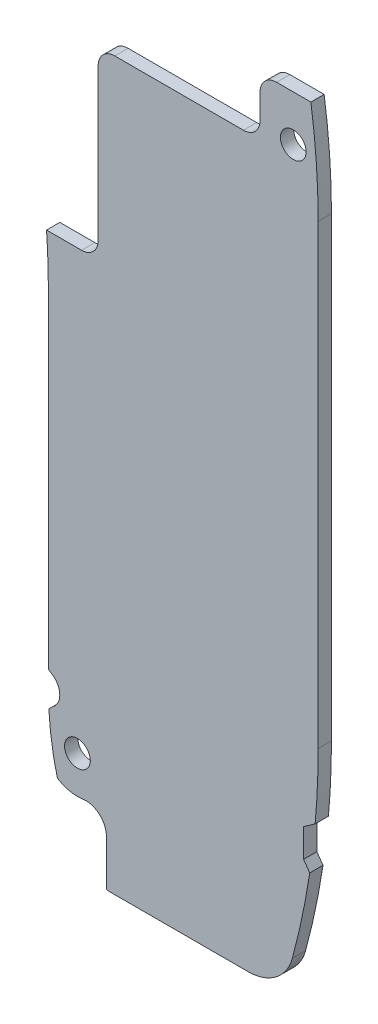
ISO-10303-21;
HEADER;
FILE_DESCRIPTION(('STEP AP214'),'2;1');
FILE_NAME('part.step','',(''),(''),'','','');
FILE_SCHEMA(('AUTOMOTIVE_DESIGN { 1 0 10303 214 1 1 1 1 }'));
ENDSEC;
DATA;
#1=APPLICATION_CONTEXT('core data for automotive mechanical design processes');
#2=APPLICATION_PROTOCOL_DEFINITION('international standard','automotive_design',2000,#1);
#3=PRODUCT_CONTEXT('',#1,'mechanical');
#4=PRODUCT('Part','Part','',(#3));
#5=PRODUCT_RELATED_PRODUCT_CATEGORY('part','',(#4));
#6=PRODUCT_DEFINITION_FORMATION('','',#4);
#7=PRODUCT_DEFINITION_CONTEXT('part definition',#1,'design');
#8=PRODUCT_DEFINITION('design','',#6,#7);
#9=PRODUCT_DEFINITION_SHAPE('','',#8);
#10=(LENGTH_UNIT() NAMED_UNIT(*) SI_UNIT(.MILLI.,.METRE.));
#11=(NAMED_UNIT(*) PLANE_ANGLE_UNIT() SI_UNIT($,.RADIAN.));
#12=(NAMED_UNIT(*) SI_UNIT($,.STERADIAN.) SOLID_ANGLE_UNIT());
#13=UNCERTAINTY_MEASURE_WITH_UNIT(LENGTH_MEASURE(1.E-05),#10,'distance_accuracy_value','');
#14=(GEOMETRIC_REPRESENTATION_CONTEXT(3) GLOBAL_UNCERTAINTY_ASSIGNED_CONTEXT((#13)) GLOBAL_UNIT_ASSIGNED_CONTEXT((#10,
#11,#12)) REPRESENTATION_CONTEXT('',''));
#15=CARTESIAN_POINT('',(0.,0.,0.));
#16=DIRECTION('',(0.,0.,1.));
#17=DIRECTION('',(1.,0.,0.));
#18=AXIS2_PLACEMENT_3D('',#15,#16,#17);
#19=CARTESIAN_POINT('',(-5.5,-58.9502537998691,0.9));
#20=CARTESIAN_POINT('',(-5.33570494437657,-58.9828095583744,0.9));
#21=CARTESIAN_POINT('',(-5.16748953016282,-59.,0.9));
#22=CARTESIAN_POINT('',(-4.99999999999999,-59.,0.9));
#23=B_SPLINE_CURVE_WITH_KNOTS('',3,(#19,#20,#21,#22),.UNSPECIFIED.,.F.,.F.,(4,4),
(0.409205779291312,1.),.UNSPECIFIED.);
#24=DIRECTION('',(0.,0.,1.));
#25=VECTOR('',#24,1.);
#26=SURFACE_OF_LINEAR_EXTRUSION('',#23,#25);
#27=CARTESIAN_POINT('',(-5.5,-58.9502537998691,2.5));
#28=CARTESIAN_POINT('',(-5.33570494437657,-58.9828095583744,2.5));
#29=CARTESIAN_POINT('',(-5.16748953016282,-59.,2.5));
#30=CARTESIAN_POINT('',(-4.99999999999999,-59.,2.5));
#31=B_SPLINE_CURVE_WITH_KNOTS('',3,(#27,#28,#29,#30),.UNSPECIFIED.,.F.,.F.,(4,4),
(0.409205779291312,1.),.UNSPECIFIED.);
#32=CARTESIAN_POINT('',(-5.5,-58.9502537998691,2.5));
#33=VERTEX_POINT('',#32);
#34=CARTESIAN_POINT('',(-4.99999999999999,-59.,2.5));
#35=VERTEX_POINT('',#34);
#36=EDGE_CURVE('E255',#33,#35,#31,.T.);
#37=ORIENTED_EDGE('',*,*,#36,.F.);
#38=DIRECTION('',(0.,0.,1.));
#39=VECTOR('',#38,1.);
#40=CARTESIAN_POINT('',(-5.5,-58.9502537998691,0.9));
#41=LINE('',#40,#39);
#42=CARTESIAN_POINT('',(-5.5,-58.9502537998691,0.9));
#43=VERTEX_POINT('',#42);
#44=EDGE_CURVE('E11',#43,#33,#41,.T.);
#45=ORIENTED_EDGE('',*,*,#44,.F.);
#46=CARTESIAN_POINT('',(-4.99999999999999,-59.,0.9));
#47=VERTEX_POINT('',#46);
#48=EDGE_CURVE('E348',#43,#47,#23,.T.);
#49=ORIENTED_EDGE('',*,*,#48,.T.);
#50=DIRECTION('',(0.,0.,1.));
#51=VECTOR('',#50,1.);
#52=CARTESIAN_POINT('',(-4.99999999999999,-59.,0.9));
#53=LINE('',#52,#51);
#54=EDGE_CURVE('E146',#47,#35,#53,.T.);
#55=ORIENTED_EDGE('',*,*,#54,.T.);
#56=EDGE_LOOP('',(#37,#45,#49,#55));
#57=FACE_BOUND('',#56,.T.);
#58=ADVANCED_FACE('F34',(#57),#26,.T.);
#59=CARTESIAN_POINT('',(-5.49999999999998,0.,0.9));
#60=DIRECTION('',(1.,0.,0.));
#61=DIRECTION('',(0.,1.,0.));
#62=AXIS2_PLACEMENT_3D('',#59,#60,#61);
#63=PLANE('',#62);
#64=DIRECTION('',(0.,1.,0.));
#65=VECTOR('',#64,1.);
#66=CARTESIAN_POINT('',(-5.49999999999998,0.,2.5));
#67=LINE('',#66,#65);
#68=CARTESIAN_POINT('',(-5.5,-53.4282032302755,2.5));
#69=VERTEX_POINT('',#68);
#70=EDGE_CURVE('E260',#33,#69,#67,.T.);
#71=ORIENTED_EDGE('',*,*,#70,.T.);
#72=DIRECTION('',(0.,0.,1.));
#73=VECTOR('',#72,1.);
#74=CARTESIAN_POINT('',(-5.5,-53.4282032302755,0.9));
#75=LINE('',#74,#73);
#76=CARTESIAN_POINT('',(-5.5,-53.4282032302755,0.9));
#77=VERTEX_POINT('',#76);
#78=EDGE_CURVE('E43',#77,#69,#75,.T.);
#79=ORIENTED_EDGE('',*,*,#78,.F.);
#80=DIRECTION('',(0.,1.,0.));
#81=VECTOR('',#80,1.);
#82=CARTESIAN_POINT('',(-5.49999999999998,0.,0.9));
#83=LINE('',#82,#81);
#84=EDGE_CURVE('E422',#43,#77,#83,.T.);
#85=ORIENTED_EDGE('',*,*,#84,.F.);
#86=ORIENTED_EDGE('',*,*,#44,.T.);
#87=EDGE_LOOP('',(#71,#79,#85,#86));
#88=FACE_BOUND('',#87,.T.);
#89=ADVANCED_FACE('F406',(#88),#63,.F.);
#90=CARTESIAN_POINT('',(-7.99999999999999,-53.4282032302755,0.9));
#91=DIRECTION('',(0.,0.,1.));
#92=DIRECTION('',(1.,0.,0.));
#93=AXIS2_PLACEMENT_3D('',#90,#91,#92);
#94=CYLINDRICAL_SURFACE('',#93,2.50000000000002);
#95=CARTESIAN_POINT('',(-7.99999999999999,-53.4282032302755,2.5));
#96=DIRECTION('',(0.,0.,-1.));
#97=DIRECTION('',(-1.,0.,0.));
#98=AXIS2_PLACEMENT_3D('',#95,#96,#97);
#99=CIRCLE('',#98,2.50000000000002);
#100=CARTESIAN_POINT('',(-8.35714285714285,-50.9538449337485,2.5));
#101=VERTEX_POINT('',#100);
#102=EDGE_CURVE('E266',#101,#69,#99,.T.);
#103=ORIENTED_EDGE('',*,*,#102,.F.);
#104=DIRECTION('',(0.,0.,1.));
#105=VECTOR('',#104,1.);
#106=CARTESIAN_POINT('',(-8.35714285714285,-50.9538449337485,0.9));
#107=LINE('',#106,#105);
#108=CARTESIAN_POINT('',(-8.35714285714285,-50.9538449337485,0.9));
#109=VERTEX_POINT('',#108);
#110=EDGE_CURVE('E396',#109,#101,#107,.T.);
#111=ORIENTED_EDGE('',*,*,#110,.F.);
#112=CARTESIAN_POINT('',(-7.99999999999999,-53.4282032302755,0.9));
#113=DIRECTION('',(0.,0.,-1.));
#114=DIRECTION('',(-1.,0.,0.));
#115=AXIS2_PLACEMENT_3D('',#112,#113,#114);
#116=CIRCLE('',#115,2.50000000000002);
#117=EDGE_CURVE('E403',#109,#77,#116,.T.);
#118=ORIENTED_EDGE('',*,*,#117,.T.);
#119=ORIENTED_EDGE('',*,*,#78,.T.);
#120=EDGE_LOOP('',(#103,#111,#118,#119));
#121=FACE_BOUND('',#120,.T.);
#122=ADVANCED_FACE('F401',(#121),#94,.F.);
#123=CARTESIAN_POINT('',(-8.99999999999999,-46.5,0.9));
#124=DIRECTION('',(0.,0.,1.));
#125=DIRECTION('',(1.,0.,0.));
#126=AXIS2_PLACEMENT_3D('',#123,#124,#125);
#127=CYLINDRICAL_SURFACE('',#126,4.49999999999995);
#128=CARTESIAN_POINT('',(-8.99999999999999,-46.5,2.5));
#129=DIRECTION('',(0.,0.,-1.));
#130=DIRECTION('',(-1.,0.,0.));
#131=AXIS2_PLACEMENT_3D('',#128,#129,#130);
#132=CIRCLE('',#131,4.49999999999995);
#133=CARTESIAN_POINT('',(-11.3970298699785,-50.3084442758731,2.5));
#134=VERTEX_POINT('',#133);
#135=EDGE_CURVE('E269',#101,#134,#132,.T.);
#136=ORIENTED_EDGE('',*,*,#135,.T.);
#137=DIRECTION('',(0.,0.,1.));
#138=VECTOR('',#137,1.);
#139=CARTESIAN_POINT('',(-11.3970298699785,-50.3084442758731,0.9));
#140=LINE('',#139,#138);
#141=CARTESIAN_POINT('',(-11.3970298699785,-50.3084442758731,0.9));
#142=VERTEX_POINT('',#141);
#143=EDGE_CURVE('E394',#142,#134,#140,.T.);
#144=ORIENTED_EDGE('',*,*,#143,.F.);
#145=CARTESIAN_POINT('',(-8.99999999999999,-46.5,0.9));
#146=DIRECTION('',(0.,0.,-1.));
#147=DIRECTION('',(-1.,0.,0.));
#148=AXIS2_PLACEMENT_3D('',#145,#146,#147);
#149=CIRCLE('',#148,4.49999999999995);
#150=EDGE_CURVE('E418',#109,#142,#149,.T.);
#151=ORIENTED_EDGE('',*,*,#150,.F.);
#152=ORIENTED_EDGE('',*,*,#110,.T.);
#153=EDGE_LOOP('',(#136,#144,#151,#152));
#154=FACE_BOUND('',#153,.T.);
#155=ADVANCED_FACE('F415',(#154),#127,.T.);
#156=CARTESIAN_POINT('',(-12.4410048815676,-43.6000887246283,0.9));
#157=CARTESIAN_POINT('',(-12.3137367209757,-45.8595415434526,0.9));
#158=CARTESIAN_POINT('',(-11.983663071939,-48.1227668725149,0.9));
#159=CARTESIAN_POINT('',(-11.3970298699785,-50.3084442758731,0.9));
#160=B_SPLINE_CURVE_WITH_KNOTS('',3,(#156,#157,#158,#159),.UNSPECIFIED.,.F.,.F.,(4,4),
(0.0264344323969909,0.973938345812274),.UNSPECIFIED.);
#161=DIRECTION('',(0.,0.,1.));
#162=VECTOR('',#161,1.);
#163=SURFACE_OF_LINEAR_EXTRUSION('',#160,#162);
#164=CARTESIAN_POINT('',(-12.4410048815676,-43.6000887246283,2.5));
#165=CARTESIAN_POINT('',(-12.3137367209757,-45.8595415434526,2.5));
#166=CARTESIAN_POINT('',(-11.983663071939,-48.1227668725149,2.5));
#167=CARTESIAN_POINT('',(-11.3970298699785,-50.3084442758731,2.5));
#168=B_SPLINE_CURVE_WITH_KNOTS('',3,(#164,#165,#166,#167),.UNSPECIFIED.,.F.,.F.,(4,4),
(0.0264344323969909,0.973938345812274),.UNSPECIFIED.);
#169=CARTESIAN_POINT('',(-12.4410048815676,-43.6000887246283,2.5));
#170=VERTEX_POINT('',#169);
#171=EDGE_CURVE('E272',#170,#134,#168,.T.);
#172=ORIENTED_EDGE('',*,*,#171,.F.);
#173=DIRECTION('',(0.,0.,1.));
#174=VECTOR('',#173,1.);
#175=CARTESIAN_POINT('',(-12.4410048815676,-43.6000887246283,0.9));
#176=LINE('',#175,#174);
#177=CARTESIAN_POINT('',(-12.4410048815676,-43.6000887246283,0.9));
#178=VERTEX_POINT('',#177);
#179=EDGE_CURVE('E392',#178,#170,#176,.T.);
#180=ORIENTED_EDGE('',*,*,#179,.F.);
#181=EDGE_CURVE('E420',#178,#142,#160,.T.);
#182=ORIENTED_EDGE('',*,*,#181,.T.);
#183=ORIENTED_EDGE('',*,*,#143,.T.);
#184=EDGE_LOOP('',(#172,#180,#182,#183));
#185=FACE_BOUND('',#184,.T.);
#186=ADVANCED_FACE('F436',(#185),#163,.T.);
#187=CARTESIAN_POINT('',(-8.99999999999999,-46.5,0.9));
#188=DIRECTION('',(0.,0.,1.));
#189=DIRECTION('',(1.,0.,0.));
#190=AXIS2_PLACEMENT_3D('',#187,#188,#189);
#191=CYLINDRICAL_SURFACE('',#190,4.5);
#192=CARTESIAN_POINT('',(-8.99999999999999,-46.5,2.5));
#193=DIRECTION('',(0.,0.,-1.));
#194=DIRECTION('',(-1.,0.,0.));
#195=AXIS2_PLACEMENT_3D('',#192,#193,#194);
#196=CIRCLE('',#195,4.5);
#197=CARTESIAN_POINT('',(-11.8551644936879,-43.0217769315377,2.5));
#198=VERTEX_POINT('',#197);
#199=EDGE_CURVE('E277',#170,#198,#196,.T.);
#200=ORIENTED_EDGE('',*,*,#199,.T.);
#201=DIRECTION('',(0.,0.,1.));
#202=VECTOR('',#201,1.);
#203=CARTESIAN_POINT('',(-11.8551644936879,-43.0217769315377,0.9));
#204=LINE('',#203,#202);
#205=CARTESIAN_POINT('',(-11.8551644936879,-43.0217769315377,0.9));
#206=VERTEX_POINT('',#205);
#207=EDGE_CURVE('E390',#206,#198,#204,.T.);
#208=ORIENTED_EDGE('',*,*,#207,.F.);
#209=CARTESIAN_POINT('',(-8.99999999999999,-46.5,0.9));
#210=DIRECTION('',(0.,0.,-1.));
#211=DIRECTION('',(-1.,0.,0.));
#212=AXIS2_PLACEMENT_3D('',#209,#210,#211);
#213=CIRCLE('',#212,4.5);
#214=EDGE_CURVE('E430',#178,#206,#213,.T.);
#215=ORIENTED_EDGE('',*,*,#214,.F.);
#216=ORIENTED_EDGE('',*,*,#179,.T.);
#217=EDGE_LOOP('',(#200,#208,#215,#216));
#218=FACE_BOUND('',#217,.T.);
#219=ADVANCED_FACE('F440',(#218),#191,.T.);
#220=CARTESIAN_POINT('',(-13.1241264908826,-41.4759000122211,0.9));
#221=DIRECTION('',(0.,0.,1.));
#222=DIRECTION('',(1.,0.,0.));
#223=AXIS2_PLACEMENT_3D('',#220,#221,#222);
#224=CYLINDRICAL_SURFACE('',#223,2.);
#225=CARTESIAN_POINT('',(-13.1241264908826,-41.4759000122211,2.5));
#226=DIRECTION('',(0.,0.,-1.));
#227=DIRECTION('',(-1.,0.,0.));
#228=AXIS2_PLACEMENT_3D('',#225,#226,#227);
#229=CIRCLE('',#228,2.);
#230=CARTESIAN_POINT('',(-11.9769736181805,-39.8375959236431,2.5));
#231=VERTEX_POINT('',#230);
#232=EDGE_CURVE('E283',#231,#198,#229,.T.);
#233=ORIENTED_EDGE('',*,*,#232,.F.);
#234=DIRECTION('',(0.,0.,1.));
#235=VECTOR('',#234,1.);
#236=CARTESIAN_POINT('',(-11.9769736181805,-39.8375959236431,0.9));
#237=LINE('',#236,#235);
#238=CARTESIAN_POINT('',(-11.9769736181805,-39.8375959236431,0.9));
#239=VERTEX_POINT('',#238);
#240=EDGE_CURVE('E388',#239,#231,#237,.T.);
#241=ORIENTED_EDGE('',*,*,#240,.F.);
#242=CARTESIAN_POINT('',(-13.1241264908826,-41.4759000122211,0.9));
#243=DIRECTION('',(0.,0.,-1.));
#244=DIRECTION('',(-1.,0.,0.));
#245=AXIS2_PLACEMENT_3D('',#242,#243,#244);
#246=CIRCLE('',#245,2.);
#247=EDGE_CURVE('E571',#239,#206,#246,.T.);
#248=ORIENTED_EDGE('',*,*,#247,.T.);
#249=ORIENTED_EDGE('',*,*,#207,.T.);
#250=EDGE_LOOP('',(#233,#241,#248,#249));
#251=FACE_BOUND('',#250,.T.);
#252=ADVANCED_FACE('F551',(#251),#224,.F.);
#253=CARTESIAN_POINT('',(-22.6578511519905,-32.3587649597745,0.9));
#254=DIRECTION('',(-0.57357643635105,-0.819152044288989,0.));
#255=DIRECTION('',(0.819152044288989,-0.57357643635105,0.));
#256=AXIS2_PLACEMENT_3D('',#253,#254,#255);
#257=PLANE('',#256);
#258=DIRECTION('',(0.819152044288989,-0.57357643635105,0.));
#259=VECTOR('',#258,1.);
#260=CARTESIAN_POINT('',(-22.6578511519905,-32.3587649597745,2.5));
#261=LINE('',#260,#259);
#262=CARTESIAN_POINT('',(-12.5,-39.4713689084105,2.5));
#263=VERTEX_POINT('',#262);
#264=EDGE_CURVE('E286',#263,#231,#261,.T.);
#265=ORIENTED_EDGE('',*,*,#264,.F.);
#266=DIRECTION('',(0.,0.,1.));
#267=VECTOR('',#266,1.);
#268=CARTESIAN_POINT('',(-12.5,-39.4713689084105,0.9));
#269=LINE('',#268,#267);
#270=CARTESIAN_POINT('',(-12.5,-39.4713689084105,0.9));
#271=VERTEX_POINT('',#270);
#272=EDGE_CURVE('E386',#271,#263,#269,.T.);
#273=ORIENTED_EDGE('',*,*,#272,.F.);
#274=DIRECTION('',(0.819152044288989,-0.57357643635105,0.));
#275=VECTOR('',#274,1.);
#276=CARTESIAN_POINT('',(-22.6578511519905,-32.3587649597745,0.9));
#277=LINE('',#276,#275);
#278=EDGE_CURVE('E569',#271,#239,#277,.T.);
#279=ORIENTED_EDGE('',*,*,#278,.T.);
#280=ORIENTED_EDGE('',*,*,#240,.T.);
#281=EDGE_LOOP('',(#265,#273,#279,#280));
#282=FACE_BOUND('',#281,.T.);
#283=ADVANCED_FACE('F548',(#282),#257,.T.);
#284=CARTESIAN_POINT('',(-12.5,0.,0.9));
#285=DIRECTION('',(1.,0.,0.));
#286=DIRECTION('',(0.,1.,0.));
#287=AXIS2_PLACEMENT_3D('',#284,#285,#286);
#288=PLANE('',#287);
#289=DIRECTION('',(0.,1.,0.));
#290=VECTOR('',#289,1.);
#291=CARTESIAN_POINT('',(-12.5,0.,2.5));
#292=LINE('',#291,#290);
#293=CARTESIAN_POINT('',(-12.5,0.,2.5));
#294=VERTEX_POINT('',#293);
#295=EDGE_CURVE('E289',#263,#294,#292,.T.);
#296=ORIENTED_EDGE('',*,*,#295,.T.);
#297=DIRECTION('',(0.,0.,1.));
#298=VECTOR('',#297,1.);
#299=CARTESIAN_POINT('',(-12.5,0.,0.9));
#300=LINE('',#299,#298);
#301=CARTESIAN_POINT('',(-12.5,0.,0.9));
#302=VERTEX_POINT('',#301);
#303=EDGE_CURVE('E384',#302,#294,#300,.T.);
#304=ORIENTED_EDGE('',*,*,#303,.F.);
#305=DIRECTION('',(0.,1.,0.));
#306=VECTOR('',#305,1.);
#307=CARTESIAN_POINT('',(-12.5,0.,0.9));
#308=LINE('',#307,#306);
#309=EDGE_CURVE('E570',#271,#302,#308,.T.);
#310=ORIENTED_EDGE('',*,*,#309,.F.);
#311=ORIENTED_EDGE('',*,*,#272,.T.);
#312=EDGE_LOOP('',(#296,#304,#310,#311));
#313=FACE_BOUND('',#312,.T.);
#314=ADVANCED_FACE('F544',(#313),#288,.F.);
#315=CARTESIAN_POINT('',(-102.5,0.,0.9));
#316=DIRECTION('',(0.,0.,1.));
#317=DIRECTION('',(1.,0.,0.));
#318=AXIS2_PLACEMENT_3D('',#315,#316,#317);
#319=CYLINDRICAL_SURFACE('',#318,90.);
#320=CARTESIAN_POINT('',(-102.5,0.,2.5));
#321=DIRECTION('',(0.,0.,-1.));
#322=DIRECTION('',(-1.,0.,0.));
#323=AXIS2_PLACEMENT_3D('',#320,#321,#322);
#324=CIRCLE('',#323,90.);
#325=CARTESIAN_POINT('',(-12.7156957945738,6.22725608494492,2.5));
#326=VERTEX_POINT('',#325);
#327=EDGE_CURVE('E292',#326,#294,#324,.T.);
#328=ORIENTED_EDGE('',*,*,#327,.F.);
#329=DIRECTION('',(0.,0.,1.));
#330=VECTOR('',#329,1.);
#331=CARTESIAN_POINT('',(-12.7156957945738,6.22725608494492,0.9));
#332=LINE('',#331,#330);
#333=CARTESIAN_POINT('',(-12.7156957945738,6.22725608494492,0.9));
#334=VERTEX_POINT('',#333);
#335=EDGE_CURVE('E382',#334,#326,#332,.T.);
#336=ORIENTED_EDGE('',*,*,#335,.F.);
#337=CARTESIAN_POINT('',(-102.5,0.,0.9));
#338=DIRECTION('',(0.,0.,-1.));
#339=DIRECTION('',(-1.,0.,0.));
#340=AXIS2_PLACEMENT_3D('',#337,#338,#339);
#341=CIRCLE('',#340,90.);
#342=EDGE_CURVE('E573',#334,#302,#341,.T.);
#343=ORIENTED_EDGE('',*,*,#342,.T.);
#344=ORIENTED_EDGE('',*,*,#303,.T.);
#345=EDGE_LOOP('',(#328,#336,#343,#344));
#346=FACE_BOUND('',#345,.T.);
#347=ADVANCED_FACE('F540',(#346),#319,.F.);
#348=CARTESIAN_POINT('',(0.,6.22725608494496,0.9));
#349=DIRECTION('',(0.,1.,0.));
#350=DIRECTION('',(-1.,0.,0.));
#351=AXIS2_PLACEMENT_3D('',#348,#349,#350);
#352=PLANE('',#351);
#353=DIRECTION('',(-1.,0.,0.));
#354=VECTOR('',#353,1.);
#355=CARTESIAN_POINT('',(0.,6.22725608494496,2.5));
#356=LINE('',#355,#354);
#357=CARTESIAN_POINT('',(-8.49999999999999,6.22725608494493,2.5));
#358=VERTEX_POINT('',#357);
#359=EDGE_CURVE('E295',#358,#326,#356,.T.);
#360=ORIENTED_EDGE('',*,*,#359,.F.);
#361=DIRECTION('',(0.,0.,1.));
#362=VECTOR('',#361,1.);
#363=CARTESIAN_POINT('',(-8.49999999999999,6.22725608494493,0.9));
#364=LINE('',#363,#362);
#365=CARTESIAN_POINT('',(-8.49999999999999,6.22725608494493,0.9));
#366=VERTEX_POINT('',#365);
#367=EDGE_CURVE('E380',#366,#358,#364,.T.);
#368=ORIENTED_EDGE('',*,*,#367,.F.);
#369=DIRECTION('',(-1.,0.,0.));
#370=VECTOR('',#369,1.);
#371=CARTESIAN_POINT('',(0.,6.22725608494496,0.9));
#372=LINE('',#371,#370);
#373=EDGE_CURVE('E578',#366,#334,#372,.T.);
#374=ORIENTED_EDGE('',*,*,#373,.T.);
#375=ORIENTED_EDGE('',*,*,#335,.T.);
#376=EDGE_LOOP('',(#360,#368,#374,#375));
#377=FACE_BOUND('',#376,.T.);
#378=ADVANCED_FACE('F536',(#377),#352,.T.);
#379=CARTESIAN_POINT('',(-8.49999999999999,8.22725608494493,0.9));
#380=DIRECTION('',(0.,0.,1.));
#381=DIRECTION('',(1.,0.,0.));
#382=AXIS2_PLACEMENT_3D('',#379,#380,#381);
#383=CYLINDRICAL_SURFACE('',#382,2.);
#384=CARTESIAN_POINT('',(-8.49999999999999,8.22725608494493,2.5));
#385=DIRECTION('',(0.,0.,-1.));
#386=DIRECTION('',(-1.,0.,0.));
#387=AXIS2_PLACEMENT_3D('',#384,#385,#386);
#388=CIRCLE('',#387,2.);
#389=CARTESIAN_POINT('',(-6.5,8.22725608494493,2.5));
#390=VERTEX_POINT('',#389);
#391=EDGE_CURVE('E298',#390,#358,#388,.T.);
#392=ORIENTED_EDGE('',*,*,#391,.F.);
#393=DIRECTION('',(0.,0.,1.));
#394=VECTOR('',#393,1.);
#395=CARTESIAN_POINT('',(-6.5,8.22725608494493,0.9));
#396=LINE('',#395,#394);
#397=CARTESIAN_POINT('',(-6.5,8.22725608494493,0.9));
#398=VERTEX_POINT('',#397);
#399=EDGE_CURVE('E378',#398,#390,#396,.T.);
#400=ORIENTED_EDGE('',*,*,#399,.F.);
#401=CARTESIAN_POINT('',(-8.49999999999999,8.22725608494493,0.9));
#402=DIRECTION('',(0.,0.,-1.));
#403=DIRECTION('',(-1.,0.,0.));
#404=AXIS2_PLACEMENT_3D('',#401,#402,#403);
#405=CIRCLE('',#404,2.);
#406=EDGE_CURVE('E581',#398,#366,#405,.T.);
#407=ORIENTED_EDGE('',*,*,#406,.T.);
#408=ORIENTED_EDGE('',*,*,#367,.T.);
#409=EDGE_LOOP('',(#392,#400,#407,#408));
#410=FACE_BOUND('',#409,.T.);
#411=ADVANCED_FACE('F532',(#410),#383,.F.);
#412=CARTESIAN_POINT('',(-6.5,0.,0.9));
#413=DIRECTION('',(-1.,0.,0.));
#414=DIRECTION('',(0.,-1.,0.));
#415=AXIS2_PLACEMENT_3D('',#412,#413,#414);
#416=PLANE('',#415);
#417=DIRECTION('',(0.,-1.,0.));
#418=VECTOR('',#417,1.);
#419=CARTESIAN_POINT('',(-6.5,0.,2.5));
#420=LINE('',#419,#418);
#421=CARTESIAN_POINT('',(-6.49999999999999,26.5,2.5));
#422=VERTEX_POINT('',#421);
#423=EDGE_CURVE('E301',#422,#390,#420,.T.);
#424=ORIENTED_EDGE('',*,*,#423,.F.);
#425=DIRECTION('',(0.,0.,1.));
#426=VECTOR('',#425,1.);
#427=CARTESIAN_POINT('',(-6.49999999999999,26.5,0.9));
#428=LINE('',#427,#426);
#429=CARTESIAN_POINT('',(-6.49999999999999,26.5,0.9));
#430=VERTEX_POINT('',#429);
#431=EDGE_CURVE('E376',#430,#422,#428,.T.);
#432=ORIENTED_EDGE('',*,*,#431,.F.);
#433=DIRECTION('',(0.,-1.,0.));
#434=VECTOR('',#433,1.);
#435=CARTESIAN_POINT('',(-6.5,0.,0.9));
#436=LINE('',#435,#434);
#437=EDGE_CURVE('E584',#430,#398,#436,.T.);
#438=ORIENTED_EDGE('',*,*,#437,.T.);
#439=ORIENTED_EDGE('',*,*,#399,.T.);
#440=EDGE_LOOP('',(#424,#432,#438,#439));
#441=FACE_BOUND('',#440,.T.);
#442=ADVANCED_FACE('F528',(#441),#416,.T.);
#443=CARTESIAN_POINT('',(-4.49999999999999,26.5,0.9));
#444=DIRECTION('',(0.,0.,1.));
#445=DIRECTION('',(1.,0.,0.));
#446=AXIS2_PLACEMENT_3D('',#443,#444,#445);
#447=CYLINDRICAL_SURFACE('',#446,2.);
#448=CARTESIAN_POINT('',(-4.49999999999999,26.5,2.5));
#449=DIRECTION('',(0.,0.,-1.));
#450=DIRECTION('',(-1.,0.,0.));
#451=AXIS2_PLACEMENT_3D('',#448,#449,#450);
#452=CIRCLE('',#451,2.);
#453=CARTESIAN_POINT('',(-4.49999999999999,28.5,2.5));
#454=VERTEX_POINT('',#453);
#455=EDGE_CURVE('E304',#454,#422,#452,.F.);
#456=ORIENTED_EDGE('',*,*,#455,.F.);
#457=DIRECTION('',(0.,0.,1.));
#458=VECTOR('',#457,1.);
#459=CARTESIAN_POINT('',(-4.49999999999999,28.5,0.9));
#460=LINE('',#459,#458);
#461=CARTESIAN_POINT('',(-4.49999999999999,28.5,0.9));
#462=VERTEX_POINT('',#461);
#463=EDGE_CURVE('E374',#462,#454,#460,.T.);
#464=ORIENTED_EDGE('',*,*,#463,.F.);
#465=CARTESIAN_POINT('',(-4.49999999999999,26.5,0.9));
#466=DIRECTION('',(0.,0.,-1.));
#467=DIRECTION('',(-1.,0.,0.));
#468=AXIS2_PLACEMENT_3D('',#465,#466,#467);
#469=CIRCLE('',#468,2.);
#470=EDGE_CURVE('E587',#462,#430,#469,.F.);
#471=ORIENTED_EDGE('',*,*,#470,.T.);
#472=ORIENTED_EDGE('',*,*,#431,.T.);
#473=EDGE_LOOP('',(#456,#464,#471,#472));
#474=FACE_BOUND('',#473,.T.);
#475=ADVANCED_FACE('F524',(#474),#447,.T.);
#476=CARTESIAN_POINT('',(0.,28.5,0.9));
#477=DIRECTION('',(0.,1.,0.));
#478=DIRECTION('',(0.,0.,1.));
#479=AXIS2_PLACEMENT_3D('',#476,#477,#478);
#480=PLANE('',#479);
#481=DIRECTION('',(-1.,0.,0.));
#482=VECTOR('',#481,1.);
#483=CARTESIAN_POINT('',(0.,28.5,2.5));
#484=LINE('',#483,#482);
#485=CARTESIAN_POINT('',(11.,28.5,2.5));
#486=VERTEX_POINT('',#485);
#487=EDGE_CURVE('E307',#486,#454,#484,.T.);
#488=ORIENTED_EDGE('',*,*,#487,.F.);
#489=DIRECTION('',(0.,0.,1.));
#490=VECTOR('',#489,1.);
#491=CARTESIAN_POINT('',(11.,28.5,0.9));
#492=LINE('',#491,#490);
#493=CARTESIAN_POINT('',(11.,28.5,0.9));
#494=VERTEX_POINT('',#493);
#495=EDGE_CURVE('E372',#494,#486,#492,.T.);
#496=ORIENTED_EDGE('',*,*,#495,.F.);
#497=DIRECTION('',(-1.,0.,0.));
#498=VECTOR('',#497,1.);
#499=CARTESIAN_POINT('',(0.,28.5,0.9));
#500=LINE('',#499,#498);
#501=EDGE_CURVE('E590',#494,#462,#500,.T.);
#502=ORIENTED_EDGE('',*,*,#501,.T.);
#503=ORIENTED_EDGE('',*,*,#463,.T.);
#504=EDGE_LOOP('',(#488,#496,#502,#503));
#505=FACE_BOUND('',#504,.T.);
#506=ADVANCED_FACE('F520',(#505),#480,.T.);
#507=CARTESIAN_POINT('',(11.,30.5,0.9));
#508=DIRECTION('',(0.,0.,1.));
#509=DIRECTION('',(1.,0.,0.));
#510=AXIS2_PLACEMENT_3D('',#507,#508,#509);
#511=CYLINDRICAL_SURFACE('',#510,2.);
#512=CARTESIAN_POINT('',(11.,30.5,2.5));
#513=DIRECTION('',(0.,0.,-1.));
#514=DIRECTION('',(-1.,0.,0.));
#515=AXIS2_PLACEMENT_3D('',#512,#513,#514);
#516=CIRCLE('',#515,2.);
#517=CARTESIAN_POINT('',(13.,30.5,2.5));
#518=VERTEX_POINT('',#517);
#519=EDGE_CURVE('E310',#518,#486,#516,.T.);
#520=ORIENTED_EDGE('',*,*,#519,.F.);
#521=DIRECTION('',(0.,0.,1.));
#522=VECTOR('',#521,1.);
#523=CARTESIAN_POINT('',(13.,30.5,0.9));
#524=LINE('',#523,#522);
#525=CARTESIAN_POINT('',(13.,30.5,0.9));
#526=VERTEX_POINT('',#525);
#527=EDGE_CURVE('E370',#526,#518,#524,.T.);
#528=ORIENTED_EDGE('',*,*,#527,.F.);
#529=CARTESIAN_POINT('',(11.,30.5,0.9));
#530=DIRECTION('',(0.,0.,-1.));
#531=DIRECTION('',(-1.,0.,0.));
#532=AXIS2_PLACEMENT_3D('',#529,#530,#531);
#533=CIRCLE('',#532,2.);
#534=EDGE_CURVE('E593',#526,#494,#533,.T.);
#535=ORIENTED_EDGE('',*,*,#534,.T.);
#536=ORIENTED_EDGE('',*,*,#495,.T.);
#537=EDGE_LOOP('',(#520,#528,#535,#536));
#538=FACE_BOUND('',#537,.T.);
#539=ADVANCED_FACE('F516',(#538),#511,.F.);
#540=CARTESIAN_POINT('',(13.,0.,0.9));
#541=DIRECTION('',(-1.,0.,0.));
#542=DIRECTION('',(0.,-1.,0.));
#543=AXIS2_PLACEMENT_3D('',#540,#541,#542);
#544=PLANE('',#543);
#545=DIRECTION('',(0.,-1.,0.));
#546=VECTOR('',#545,1.);
#547=CARTESIAN_POINT('',(13.,0.,2.5));
#548=LINE('',#547,#546);
#549=CARTESIAN_POINT('',(13.,33.5,2.5));
#550=VERTEX_POINT('',#549);
#551=EDGE_CURVE('E313',#550,#518,#548,.T.);
#552=ORIENTED_EDGE('',*,*,#551,.F.);
#553=DIRECTION('',(0.,0.,1.));
#554=VECTOR('',#553,1.);
#555=CARTESIAN_POINT('',(13.,33.5,0.9));
#556=LINE('',#555,#554);
#557=CARTESIAN_POINT('',(13.,33.5,0.9));
#558=VERTEX_POINT('',#557);
#559=EDGE_CURVE('E368',#558,#550,#556,.T.);
#560=ORIENTED_EDGE('',*,*,#559,.F.);
#561=DIRECTION('',(0.,-1.,0.));
#562=VECTOR('',#561,1.);
#563=CARTESIAN_POINT('',(13.,0.,0.9));
#564=LINE('',#563,#562);
#565=EDGE_CURVE('E596',#558,#526,#564,.T.);
#566=ORIENTED_EDGE('',*,*,#565,.T.);
#567=ORIENTED_EDGE('',*,*,#527,.T.);
#568=EDGE_LOOP('',(#552,#560,#566,#567));
#569=FACE_BOUND('',#568,.T.);
#570=ADVANCED_FACE('F512',(#569),#544,.T.);
#571=CARTESIAN_POINT('',(15.,33.5,0.9));
#572=DIRECTION('',(0.,0.,1.));
#573=DIRECTION('',(1.,0.,0.));
#574=AXIS2_PLACEMENT_3D('',#571,#572,#573);
#575=CYLINDRICAL_SURFACE('',#574,2.);
#576=CARTESIAN_POINT('',(15.,33.5,2.5));
#577=DIRECTION('',(0.,0.,-1.));
#578=DIRECTION('',(-1.,0.,0.));
#579=AXIS2_PLACEMENT_3D('',#576,#577,#578);
#580=CIRCLE('',#579,2.);
#581=CARTESIAN_POINT('',(15.,35.5,2.5));
#582=VERTEX_POINT('',#581);
#583=EDGE_CURVE('E316',#582,#550,#580,.F.);
#584=ORIENTED_EDGE('',*,*,#583,.F.);
#585=DIRECTION('',(0.,0.,1.));
#586=VECTOR('',#585,1.);
#587=CARTESIAN_POINT('',(15.,35.5,0.9));
#588=LINE('',#587,#586);
#589=CARTESIAN_POINT('',(15.,35.5,0.9));
#590=VERTEX_POINT('',#589);
#591=EDGE_CURVE('E366',#590,#582,#588,.T.);
#592=ORIENTED_EDGE('',*,*,#591,.F.);
#593=CARTESIAN_POINT('',(15.,33.5,0.9));
#594=DIRECTION('',(0.,0.,-1.));
#595=DIRECTION('',(-1.,0.,0.));
#596=AXIS2_PLACEMENT_3D('',#593,#594,#595);
#597=CIRCLE('',#596,2.);
#598=EDGE_CURVE('E599',#590,#558,#597,.F.);
#599=ORIENTED_EDGE('',*,*,#598,.T.);
#600=ORIENTED_EDGE('',*,*,#559,.T.);
#601=EDGE_LOOP('',(#584,#592,#599,#600));
#602=FACE_BOUND('',#601,.T.);
#603=ADVANCED_FACE('F508',(#602),#575,.T.);
#604=CARTESIAN_POINT('',(0.,35.5,0.9));
#605=DIRECTION('',(0.,1.,0.));
#606=DIRECTION('',(0.,0.,1.));
#607=AXIS2_PLACEMENT_3D('',#604,#605,#606);
#608=PLANE('',#607);
#609=DIRECTION('',(-1.,0.,0.));
#610=VECTOR('',#609,1.);
#611=CARTESIAN_POINT('',(0.,35.5,2.5));
#612=LINE('',#611,#610);
#613=CARTESIAN_POINT('',(19.1226071624767,35.5,2.5));
#614=VERTEX_POINT('',#613);
#615=EDGE_CURVE('E319',#614,#582,#612,.T.);
#616=ORIENTED_EDGE('',*,*,#615,.F.);
#617=DIRECTION('',(0.,0.,1.));
#618=VECTOR('',#617,1.);
#619=CARTESIAN_POINT('',(19.1226071624767,35.5,0.9));
#620=LINE('',#619,#618);
#621=CARTESIAN_POINT('',(19.1226071624767,35.5,0.9));
#622=VERTEX_POINT('',#621);
#623=EDGE_CURVE('E364',#622,#614,#620,.T.);
#624=ORIENTED_EDGE('',*,*,#623,.F.);
#625=DIRECTION('',(-1.,0.,0.));
#626=VECTOR('',#625,1.);
#627=CARTESIAN_POINT('',(0.,35.5,0.9));
#628=LINE('',#627,#626);
#629=EDGE_CURVE('E602',#622,#590,#628,.T.);
#630=ORIENTED_EDGE('',*,*,#629,.T.);
#631=ORIENTED_EDGE('',*,*,#591,.T.);
#632=EDGE_LOOP('',(#616,#624,#630,#631));
#633=FACE_BOUND('',#632,.T.);
#634=ADVANCED_FACE('F504',(#633),#608,.T.);
#635=CARTESIAN_POINT('',(-62.5,23.5,0.9));
#636=DIRECTION('',(0.,0.,1.));
#637=DIRECTION('',(1.,0.,0.));
#638=AXIS2_PLACEMENT_3D('',#635,#636,#637);
#639=CYLINDRICAL_SURFACE('',#638,82.5);
#640=CARTESIAN_POINT('',(-62.5,23.5,2.5));
#641=DIRECTION('',(0.,0.,-1.));
#642=DIRECTION('',(-1.,0.,0.));
#643=AXIS2_PLACEMENT_3D('',#640,#641,#642);
#644=CIRCLE('',#643,82.5);
#645=CARTESIAN_POINT('',(20.,23.5,2.5));
#646=VERTEX_POINT('',#645);
#647=EDGE_CURVE('E322',#614,#646,#644,.T.);
#648=ORIENTED_EDGE('',*,*,#647,.T.);
#649=DIRECTION('',(0.,0.,1.));
#650=VECTOR('',#649,1.);
#651=CARTESIAN_POINT('',(20.,23.5,0.9));
#652=LINE('',#651,#650);
#653=CARTESIAN_POINT('',(20.,23.5,0.9));
#654=VERTEX_POINT('',#653);
#655=EDGE_CURVE('E361',#654,#646,#652,.T.);
#656=ORIENTED_EDGE('',*,*,#655,.F.);
#657=CARTESIAN_POINT('',(-62.5,23.5,0.9));
#658=DIRECTION('',(0.,0.,-1.));
#659=DIRECTION('',(-1.,0.,0.));
#660=AXIS2_PLACEMENT_3D('',#657,#658,#659);
#661=CIRCLE('',#660,82.5);
#662=EDGE_CURVE('E605',#622,#654,#661,.T.);
#663=ORIENTED_EDGE('',*,*,#662,.F.);
#664=ORIENTED_EDGE('',*,*,#623,.T.);
#665=EDGE_LOOP('',(#648,#656,#663,#664));
#666=FACE_BOUND('',#665,.T.);
#667=ADVANCED_FACE('F500',(#666),#639,.T.);
#668=CARTESIAN_POINT('',(20.,0.,0.9));
#669=DIRECTION('',(-1.,0.,0.));
#670=DIRECTION('',(0.,0.,1.));
#671=AXIS2_PLACEMENT_3D('',#668,#669,#670);
#672=PLANE('',#671);
#673=DIRECTION('',(0.,-1.,0.));
#674=VECTOR('',#673,1.);
#675=CARTESIAN_POINT('',(20.,0.,2.5));
#676=LINE('',#675,#674);
#677=CARTESIAN_POINT('',(20.,-31.5,2.5));
#678=VERTEX_POINT('',#677);
#679=EDGE_CURVE('E324',#646,#678,#676,.T.);
#680=ORIENTED_EDGE('',*,*,#679,.T.);
#681=DIRECTION('',(0.,0.,1.));
#682=VECTOR('',#681,1.);
#683=CARTESIAN_POINT('',(20.,-31.5,0.9));
#684=LINE('',#683,#682);
#685=CARTESIAN_POINT('',(20.,-31.5,0.9));
#686=VERTEX_POINT('',#685);
#687=EDGE_CURVE('E358',#686,#678,#684,.T.);
#688=ORIENTED_EDGE('',*,*,#687,.F.);
#689=DIRECTION('',(0.,-1.,0.));
#690=VECTOR('',#689,1.);
#691=CARTESIAN_POINT('',(20.,0.,0.9));
#692=LINE('',#691,#690);
#693=EDGE_CURVE('E607',#654,#686,#692,.T.);
#694=ORIENTED_EDGE('',*,*,#693,.F.);
#695=ORIENTED_EDGE('',*,*,#655,.T.);
#696=EDGE_LOOP('',(#680,#688,#694,#695));
#697=FACE_BOUND('',#696,.T.);
#698=ADVANCED_FACE('F496',(#697),#672,.F.);
#699=CARTESIAN_POINT('',(-70.0000000000003,-31.5,0.9));
#700=DIRECTION('',(0.,0.,1.));
#701=DIRECTION('',(1.,0.,0.));
#702=AXIS2_PLACEMENT_3D('',#699,#700,#701);
#703=CYLINDRICAL_SURFACE('',#702,90.0000000000003);
#704=CARTESIAN_POINT('',(-70.0000000000003,-31.5,2.5));
#705=DIRECTION('',(0.,0.,-1.));
#706=DIRECTION('',(-1.,0.,0.));
#707=AXIS2_PLACEMENT_3D('',#704,#705,#706);
#708=CIRCLE('',#707,90.0000000000003);
#709=CARTESIAN_POINT('',(19.6395417382662,-39.5468973495153,2.5));
#710=VERTEX_POINT('',#709);
#711=EDGE_CURVE('E326',#678,#710,#708,.T.);
#712=ORIENTED_EDGE('',*,*,#711,.T.);
#713=DIRECTION('',(0.,0.,1.));
#714=VECTOR('',#713,1.);
#715=CARTESIAN_POINT('',(19.6395417382662,-39.5468973495153,0.9));
#716=LINE('',#715,#714);
#717=CARTESIAN_POINT('',(19.6395417382662,-39.5468973495153,0.9));
#718=VERTEX_POINT('',#717);
#719=EDGE_CURVE('E356',#718,#710,#716,.T.);
#720=ORIENTED_EDGE('',*,*,#719,.F.);
#721=CARTESIAN_POINT('',(-70.0000000000003,-31.5,0.9));
#722=DIRECTION('',(0.,0.,-1.));
#723=DIRECTION('',(-1.,0.,0.));
#724=AXIS2_PLACEMENT_3D('',#721,#722,#723);
#725=CIRCLE('',#724,90.0000000000003);
#726=EDGE_CURVE('E609',#686,#718,#725,.T.);
#727=ORIENTED_EDGE('',*,*,#726,.F.);
#728=ORIENTED_EDGE('',*,*,#687,.T.);
#729=EDGE_LOOP('',(#712,#720,#727,#728));
#730=FACE_BOUND('',#729,.T.);
#731=ADVANCED_FACE('F492',(#730),#703,.T.);
#732=CARTESIAN_POINT('',(25.0421752362054,-35.763932648074,0.9));
#733=DIRECTION('',(0.57357643635104,-0.819152044288996,0.));
#734=DIRECTION('',(0.819152044288996,0.57357643635104,0.));
#735=AXIS2_PLACEMENT_3D('',#732,#733,#734);
#736=PLANE('',#735);
#737=DIRECTION('',(0.819152044288996,0.57357643635104,0.));
#738=VECTOR('',#737,1.);
#739=CARTESIAN_POINT('',(25.0421752362054,-35.763932648074,2.5));
#740=LINE('',#739,#738);
#741=CARTESIAN_POINT('',(18.2474075308823,-40.5216802157251,2.5));
#742=VERTEX_POINT('',#741);
#743=EDGE_CURVE('E329',#742,#710,#740,.T.);
#744=ORIENTED_EDGE('',*,*,#743,.F.);
#745=DIRECTION('',(0.,0.,1.));
#746=VECTOR('',#745,1.);
#747=CARTESIAN_POINT('',(18.2474075308823,-40.5216802157251,0.9));
#748=LINE('',#747,#746);
#749=CARTESIAN_POINT('',(18.2474075308823,-40.5216802157251,0.9));
#750=VERTEX_POINT('',#749);
#751=EDGE_CURVE('E354',#750,#742,#748,.T.);
#752=ORIENTED_EDGE('',*,*,#751,.F.);
#753=DIRECTION('',(0.819152044288996,0.57357643635104,0.));
#754=VECTOR('',#753,1.);
#755=CARTESIAN_POINT('',(25.0421752362054,-35.763932648074,0.9));
#756=LINE('',#755,#754);
#757=EDGE_CURVE('E611',#750,#718,#756,.T.);
#758=ORIENTED_EDGE('',*,*,#757,.T.);
#759=ORIENTED_EDGE('',*,*,#719,.T.);
#760=EDGE_LOOP('',(#744,#752,#758,#759));
#761=FACE_BOUND('',#760,.T.);
#762=ADVANCED_FACE('F488',(#761),#736,.T.);
#763=CARTESIAN_POINT('',(18.2474075308823,0.,0.9));
#764=DIRECTION('',(1.,0.,0.));
#765=DIRECTION('',(0.,0.,-1.));
#766=AXIS2_PLACEMENT_3D('',#763,#764,#765);
#767=PLANE('',#766);
#768=DIRECTION('',(0.,1.,0.));
#769=VECTOR('',#768,1.);
#770=CARTESIAN_POINT('',(18.2474075308823,0.,2.5));
#771=LINE('',#770,#769);
#772=CARTESIAN_POINT('',(18.2474075308823,-43.9396131354404,2.5));
#773=VERTEX_POINT('',#772);
#774=EDGE_CURVE('E332',#773,#742,#771,.T.);
#775=ORIENTED_EDGE('',*,*,#774,.F.);
#776=DIRECTION('',(0.,0.,1.));
#777=VECTOR('',#776,1.);
#778=CARTESIAN_POINT('',(18.2474075308823,-43.9396131354404,0.9));
#779=LINE('',#778,#777);
#780=CARTESIAN_POINT('',(18.2474075308823,-43.9396131354404,0.9));
#781=VERTEX_POINT('',#780);
#782=EDGE_CURVE('E352',#781,#773,#779,.T.);
#783=ORIENTED_EDGE('',*,*,#782,.F.);
#784=DIRECTION('',(0.,1.,0.));
#785=VECTOR('',#784,1.);
#786=CARTESIAN_POINT('',(18.2474075308823,0.,0.9));
#787=LINE('',#786,#785);
#788=EDGE_CURVE('E614',#781,#750,#787,.T.);
#789=ORIENTED_EDGE('',*,*,#788,.T.);
#790=ORIENTED_EDGE('',*,*,#751,.T.);
#791=EDGE_LOOP('',(#775,#783,#789,#790));
#792=FACE_BOUND('',#791,.T.);
#793=ADVANCED_FACE('F484',(#792),#767,.T.);
#794=CARTESIAN_POINT('',(-8.40067087682161,-5.88221307396904,0.9));
#795=DIRECTION('',(0.819152044289002,0.573576436351031,0.));
#796=DIRECTION('',(-0.573576436351031,0.819152044289002,0.));
#797=AXIS2_PLACEMENT_3D('',#794,#795,#796);
#798=PLANE('',#797);
#799=DIRECTION('',(-0.573576436351031,0.819152044289002,0.));
#800=VECTOR('',#799,1.);
#801=CARTESIAN_POINT('',(-8.40067087682161,-5.88221307396904,2.5));
#802=LINE('',#801,#800);
#803=CARTESIAN_POINT('',(18.983192225318,-44.9904225801902,2.5));
#804=VERTEX_POINT('',#803);
#805=EDGE_CURVE('E335',#804,#773,#802,.T.);
#806=ORIENTED_EDGE('',*,*,#805,.F.);
#807=DIRECTION('',(0.,0.,1.));
#808=VECTOR('',#807,1.);
#809=CARTESIAN_POINT('',(18.983192225318,-44.9904225801902,0.9));
#810=LINE('',#809,#808);
#811=CARTESIAN_POINT('',(18.983192225318,-44.9904225801902,0.9));
#812=VERTEX_POINT('',#811);
#813=EDGE_CURVE('E241',#812,#804,#810,.T.);
#814=ORIENTED_EDGE('',*,*,#813,.F.);
#815=DIRECTION('',(-0.573576436351031,0.819152044289002,0.));
#816=VECTOR('',#815,1.);
#817=CARTESIAN_POINT('',(-8.40067087682161,-5.88221307396904,0.9));
#818=LINE('',#817,#816);
#819=EDGE_CURVE('E234',#812,#781,#818,.T.);
#820=ORIENTED_EDGE('',*,*,#819,.T.);
#821=ORIENTED_EDGE('',*,*,#782,.T.);
#822=EDGE_LOOP('',(#806,#814,#820,#821));
#823=FACE_BOUND('',#822,.T.);
#824=ADVANCED_FACE('F481',(#823),#798,.T.);
#825=CARTESIAN_POINT('',(-70.0000000000003,-31.5,0.9));
#826=DIRECTION('',(0.,0.,1.));
#827=DIRECTION('',(1.,0.,0.));
#828=AXIS2_PLACEMENT_3D('',#825,#826,#827);
#829=CYLINDRICAL_SURFACE('',#828,90.0000000000003);
#830=CARTESIAN_POINT('',(-70.0000000000003,-31.5,2.5));
#831=DIRECTION('',(0.,0.,-1.));
#832=DIRECTION('',(-1.,0.,0.));
#833=AXIS2_PLACEMENT_3D('',#830,#831,#832);
#834=CIRCLE('',#833,90.0000000000003);
#835=CARTESIAN_POINT('',(16.8961655909624,-54.9319526627219,2.5));
#836=VERTEX_POINT('',#835);
#837=EDGE_CURVE('E240',#804,#836,#834,.T.);
#838=ORIENTED_EDGE('',*,*,#837,.T.);
#839=DIRECTION('',(0.,0.,1.));
#840=VECTOR('',#839,1.);
#841=CARTESIAN_POINT('',(16.8961655909624,-54.9319526627219,0.9));
#842=LINE('',#841,#840);
#843=CARTESIAN_POINT('',(16.8961655909624,-54.9319526627219,0.9));
#844=VERTEX_POINT('',#843);
#845=EDGE_CURVE('E237',#844,#836,#842,.T.);
#846=ORIENTED_EDGE('',*,*,#845,.F.);
#847=CARTESIAN_POINT('',(-70.0000000000003,-31.5,0.9));
#848=DIRECTION('',(0.,0.,-1.));
#849=DIRECTION('',(-1.,0.,0.));
#850=AXIS2_PLACEMENT_3D('',#847,#848,#849);
#851=CIRCLE('',#850,90.0000000000003);
#852=EDGE_CURVE('E226',#812,#844,#851,.T.);
#853=ORIENTED_EDGE('',*,*,#852,.F.);
#854=ORIENTED_EDGE('',*,*,#813,.T.);
#855=EDGE_LOOP('',(#838,#846,#853,#854));
#856=FACE_BOUND('',#855,.T.);
#857=ADVANCED_FACE('F238',(#856),#829,.T.);
#858=CARTESIAN_POINT('',(11.5858443604036,-53.5,0.9));
#859=DIRECTION('',(0.,0.,1.));
#860=DIRECTION('',(1.,0.,0.));
#861=AXIS2_PLACEMENT_3D('',#858,#859,#860);
#862=CYLINDRICAL_SURFACE('',#861,5.5);
#863=CARTESIAN_POINT('',(11.5858443604036,-53.5,2.5));
#864=DIRECTION('',(0.,0.,-1.));
#865=DIRECTION('',(-1.,0.,0.));
#866=AXIS2_PLACEMENT_3D('',#863,#864,#865);
#867=CIRCLE('',#866,5.5);
#868=CARTESIAN_POINT('',(11.5858443604036,-59.,2.5));
#869=VERTEX_POINT('',#868);
#870=EDGE_CURVE('E139',#836,#869,#867,.T.);
#871=ORIENTED_EDGE('',*,*,#870,.T.);
#872=DIRECTION('',(0.,0.,1.));
#873=VECTOR('',#872,1.);
#874=CARTESIAN_POINT('',(11.5858443604036,-59.,0.9));
#875=LINE('',#874,#873);
#876=CARTESIAN_POINT('',(11.5858443604036,-59.,0.9));
#877=VERTEX_POINT('',#876);
#878=EDGE_CURVE('E242',#877,#869,#875,.T.);
#879=ORIENTED_EDGE('',*,*,#878,.F.);
#880=CARTESIAN_POINT('',(11.5858443604036,-53.5,0.9));
#881=DIRECTION('',(0.,0.,-1.));
#882=DIRECTION('',(-1.,0.,0.));
#883=AXIS2_PLACEMENT_3D('',#880,#881,#882);
#884=CIRCLE('',#883,5.5);
#885=EDGE_CURVE('E231',#844,#877,#884,.T.);
#886=ORIENTED_EDGE('',*,*,#885,.F.);
#887=ORIENTED_EDGE('',*,*,#845,.T.);
#888=EDGE_LOOP('',(#871,#879,#886,#887));
#889=FACE_BOUND('',#888,.T.);
#890=ADVANCED_FACE('F244',(#889),#862,.T.);
#891=CARTESIAN_POINT('',(-8.99999999999999,-46.5,0.9));
#892=DIRECTION('',(0.,0.,1.));
#893=DIRECTION('',(1.,0.,0.));
#894=AXIS2_PLACEMENT_3D('',#891,#892,#893);
#895=CYLINDRICAL_SURFACE('',#894,1.55);
#896=CARTESIAN_POINT('',(-8.99999999999999,-46.5,0.9));
#897=DIRECTION('',(0.,0.,-1.));
#898=DIRECTION('',(-1.,0.,0.));
#899=AXIS2_PLACEMENT_3D('',#896,#897,#898);
#900=CIRCLE('',#899,1.55);
#901=CARTESIAN_POINT('',(-10.55,-46.5,0.9));
#902=VERTEX_POINT('',#901);
#903=EDGE_CURVE('E246',#902,#902,#900,.T.);
#904=ORIENTED_EDGE('',*,*,#903,.T.);
#905=EDGE_LOOP('',(#904));
#906=FACE_BOUND('',#905,.T.);
#907=CARTESIAN_POINT('',(-8.99999999999999,-46.5,2.5));
#908=DIRECTION('',(0.,0.,-1.));
#909=DIRECTION('',(-1.,0.,0.));
#910=AXIS2_PLACEMENT_3D('',#907,#908,#909);
#911=CIRCLE('',#910,1.55);
#912=CARTESIAN_POINT('',(-10.55,-46.5,2.5));
#913=VERTEX_POINT('',#912);
#914=EDGE_CURVE('E342',#913,#913,#911,.T.);
#915=ORIENTED_EDGE('',*,*,#914,.F.);
#916=EDGE_LOOP('',(#915));
#917=FACE_BOUND('',#916,.T.);
#918=ADVANCED_FACE('F465',(#906,#917),#895,.F.);
#919=CARTESIAN_POINT('',(0.,-59.,0.9));
#920=DIRECTION('',(0.,1.,0.));
#921=DIRECTION('',(0.,0.,1.));
#922=AXIS2_PLACEMENT_3D('',#919,#920,#921);
#923=PLANE('',#922);
#924=DIRECTION('',(-1.,0.,0.));
#925=VECTOR('',#924,1.);
#926=CARTESIAN_POINT('',(0.,-59.,2.5));
#927=LINE('',#926,#925);
#928=EDGE_CURVE('E340',#869,#35,#927,.T.);
#929=ORIENTED_EDGE('',*,*,#928,.T.);
#930=ORIENTED_EDGE('',*,*,#54,.F.);
#931=DIRECTION('',(-1.,0.,0.));
#932=VECTOR('',#931,1.);
#933=CARTESIAN_POINT('',(0.,-59.,0.9));
#934=LINE('',#933,#932);
#935=EDGE_CURVE('E51',#877,#47,#934,.T.);
#936=ORIENTED_EDGE('',*,*,#935,.F.);
#937=ORIENTED_EDGE('',*,*,#878,.T.);
#938=EDGE_LOOP('',(#929,#930,#936,#937));
#939=FACE_BOUND('',#938,.T.);
#940=ADVANCED_FACE('F456',(#939),#923,.F.);
#941=CARTESIAN_POINT('',(17.,30.,0.9));
#942=DIRECTION('',(0.,0.,1.));
#943=DIRECTION('',(1.,0.,0.));
#944=AXIS2_PLACEMENT_3D('',#941,#942,#943);
#945=CYLINDRICAL_SURFACE('',#944,1.55);
#946=CARTESIAN_POINT('',(17.,30.,0.9));
#947=DIRECTION('',(0.,0.,-1.));
#948=DIRECTION('',(-1.,0.,0.));
#949=AXIS2_PLACEMENT_3D('',#946,#947,#948);
#950=CIRCLE('',#949,1.55);
#951=CARTESIAN_POINT('',(15.45,30.,0.9));
#952=VERTEX_POINT('',#951);
#953=EDGE_CURVE('E252',#952,#952,#950,.T.);
#954=ORIENTED_EDGE('',*,*,#953,.T.);
#955=EDGE_LOOP('',(#954));
#956=FACE_BOUND('',#955,.T.);
#957=CARTESIAN_POINT('',(17.,30.,2.5));
#958=DIRECTION('',(0.,0.,-1.));
#959=DIRECTION('',(-1.,0.,0.));
#960=AXIS2_PLACEMENT_3D('',#957,#958,#959);
#961=CIRCLE('',#960,1.55);
#962=CARTESIAN_POINT('',(15.45,30.,2.5));
#963=VERTEX_POINT('',#962);
#964=EDGE_CURVE('E345',#963,#963,#961,.T.);
#965=ORIENTED_EDGE('',*,*,#964,.F.);
#966=EDGE_LOOP('',(#965));
#967=FACE_BOUND('',#966,.T.);
#968=ADVANCED_FACE('F464',(#956,#967),#945,.F.);
#969=CARTESIAN_POINT('',(0.,0.,0.9));
#970=DIRECTION('',(0.,0.,-1.));
#971=DIRECTION('',(-1.,0.,0.));
#972=AXIS2_PLACEMENT_3D('',#969,#970,#971);
#973=PLANE('',#972);
#974=ORIENTED_EDGE('',*,*,#48,.F.);
#975=ORIENTED_EDGE('',*,*,#84,.T.);
#976=ORIENTED_EDGE('',*,*,#117,.F.);
#977=ORIENTED_EDGE('',*,*,#150,.T.);
#978=ORIENTED_EDGE('',*,*,#181,.F.);
#979=ORIENTED_EDGE('',*,*,#214,.T.);
#980=ORIENTED_EDGE('',*,*,#247,.F.);
#981=ORIENTED_EDGE('',*,*,#278,.F.);
#982=ORIENTED_EDGE('',*,*,#309,.T.);
#983=ORIENTED_EDGE('',*,*,#342,.F.);
#984=ORIENTED_EDGE('',*,*,#373,.F.);
#985=ORIENTED_EDGE('',*,*,#406,.F.);
#986=ORIENTED_EDGE('',*,*,#437,.F.);
#987=ORIENTED_EDGE('',*,*,#470,.F.);
#988=ORIENTED_EDGE('',*,*,#501,.F.);
#989=ORIENTED_EDGE('',*,*,#534,.F.);
#990=ORIENTED_EDGE('',*,*,#565,.F.);
#991=ORIENTED_EDGE('',*,*,#598,.F.);
#992=ORIENTED_EDGE('',*,*,#629,.F.);
#993=ORIENTED_EDGE('',*,*,#662,.T.);
#994=ORIENTED_EDGE('',*,*,#693,.T.);
#995=ORIENTED_EDGE('',*,*,#726,.T.);
#996=ORIENTED_EDGE('',*,*,#757,.F.);
#997=ORIENTED_EDGE('',*,*,#788,.F.);
#998=ORIENTED_EDGE('',*,*,#819,.F.);
#999=ORIENTED_EDGE('',*,*,#852,.T.);
#1000=ORIENTED_EDGE('',*,*,#885,.T.);
#1001=ORIENTED_EDGE('',*,*,#935,.T.);
#1002=EDGE_LOOP('',(#974,#975,#976,#977,#978,#979,#980,#981,#982,#983,#984,#985,#986,#987,#988,
#989,#990,#991,#992,#993,#994,#995,#996,#997,#998,#999,#1000,#1001));
#1003=FACE_BOUND('',#1002,.T.);
#1004=ORIENTED_EDGE('',*,*,#903,.F.);
#1005=EDGE_LOOP('',(#1004));
#1006=FACE_BOUND('',#1005,.T.);
#1007=ORIENTED_EDGE('',*,*,#953,.F.);
#1008=EDGE_LOOP('',(#1007));
#1009=FACE_BOUND('',#1008,.T.);
#1010=ADVANCED_FACE('F228',(#1003,#1006,#1009),#973,.T.);
#1011=CARTESIAN_POINT('',(0.,0.,2.5));
#1012=DIRECTION('',(0.,0.,-1.));
#1013=DIRECTION('',(-1.,0.,0.));
#1014=AXIS2_PLACEMENT_3D('',#1011,#1012,#1013);
#1015=PLANE('',#1014);
#1016=ORIENTED_EDGE('',*,*,#36,.T.);
#1017=ORIENTED_EDGE('',*,*,#928,.F.);
#1018=ORIENTED_EDGE('',*,*,#870,.F.);
#1019=ORIENTED_EDGE('',*,*,#837,.F.);
#1020=ORIENTED_EDGE('',*,*,#805,.T.);
#1021=ORIENTED_EDGE('',*,*,#774,.T.);
#1022=ORIENTED_EDGE('',*,*,#743,.T.);
#1023=ORIENTED_EDGE('',*,*,#711,.F.);
#1024=ORIENTED_EDGE('',*,*,#679,.F.);
#1025=ORIENTED_EDGE('',*,*,#647,.F.);
#1026=ORIENTED_EDGE('',*,*,#615,.T.);
#1027=ORIENTED_EDGE('',*,*,#583,.T.);
#1028=ORIENTED_EDGE('',*,*,#551,.T.);
#1029=ORIENTED_EDGE('',*,*,#519,.T.);
#1030=ORIENTED_EDGE('',*,*,#487,.T.);
#1031=ORIENTED_EDGE('',*,*,#455,.T.);
#1032=ORIENTED_EDGE('',*,*,#423,.T.);
#1033=ORIENTED_EDGE('',*,*,#391,.T.);
#1034=ORIENTED_EDGE('',*,*,#359,.T.);
#1035=ORIENTED_EDGE('',*,*,#327,.T.);
#1036=ORIENTED_EDGE('',*,*,#295,.F.);
#1037=ORIENTED_EDGE('',*,*,#264,.T.);
#1038=ORIENTED_EDGE('',*,*,#232,.T.);
#1039=ORIENTED_EDGE('',*,*,#199,.F.);
#1040=ORIENTED_EDGE('',*,*,#171,.T.);
#1041=ORIENTED_EDGE('',*,*,#135,.F.);
#1042=ORIENTED_EDGE('',*,*,#102,.T.);
#1043=ORIENTED_EDGE('',*,*,#70,.F.);
#1044=EDGE_LOOP('',(#1016,#1017,#1018,#1019,#1020,#1021,#1022,#1023,#1024,#1025,#1026,#1027,
#1028,#1029,#1030,#1031,#1032,#1033,#1034,#1035,#1036,#1037,#1038,#1039,#1040,#1041,#1042,#1043));
#1045=FACE_BOUND('',#1044,.T.);
#1046=ORIENTED_EDGE('',*,*,#914,.T.);
#1047=EDGE_LOOP('',(#1046));
#1048=FACE_BOUND('',#1047,.T.);
#1049=ORIENTED_EDGE('',*,*,#964,.T.);
#1050=EDGE_LOOP('',(#1049));
#1051=FACE_BOUND('',#1050,.T.);
#1052=ADVANCED_FACE('F409',(#1045,#1048,#1051),#1015,.F.);
#1053=CLOSED_SHELL('',(#58,#89,#122,#155,#186,#219,#252,#283,#314,#347,#378,#411,#442,#475,#506,
#539,#570,#603,#634,#667,#698,#731,#762,#793,#824,#857,#890,#918,#940,#968,#1010,#1052));
#1054=MANIFOLD_SOLID_BREP('B2',#1053);
#1055=ADVANCED_BREP_SHAPE_REPRESENTATION('',(#18,#1054),#14);
#1056=SHAPE_DEFINITION_REPRESENTATION(#9,#1055);
ENDSEC;
END-ISO-10303-21;
